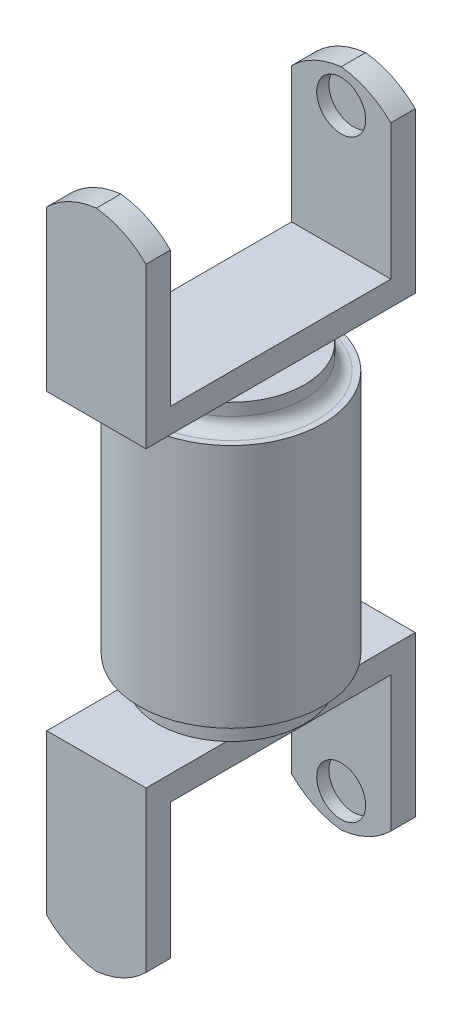
ISO-10303-21;
HEADER;
FILE_DESCRIPTION(('STEP AP214'),'2;1');
FILE_NAME('part.step','',(''),(''),'','','');
FILE_SCHEMA(('AUTOMOTIVE_DESIGN { 1 0 10303 214 1 1 1 1 }'));
ENDSEC;
DATA;
#1=APPLICATION_CONTEXT('core data for automotive mechanical design processes');
#2=APPLICATION_PROTOCOL_DEFINITION('international standard','automotive_design',2000,#1);
#3=PRODUCT_CONTEXT('',#1,'mechanical');
#4=PRODUCT('Part','Part','',(#3));
#5=PRODUCT_RELATED_PRODUCT_CATEGORY('part','',(#4));
#6=PRODUCT_DEFINITION_FORMATION('','',#4);
#7=PRODUCT_DEFINITION_CONTEXT('part definition',#1,'design');
#8=PRODUCT_DEFINITION('design','',#6,#7);
#9=PRODUCT_DEFINITION_SHAPE('','',#8);
#10=(LENGTH_UNIT() NAMED_UNIT(*) SI_UNIT(.MILLI.,.METRE.));
#11=(NAMED_UNIT(*) PLANE_ANGLE_UNIT() SI_UNIT($,.RADIAN.));
#12=(NAMED_UNIT(*) SI_UNIT($,.STERADIAN.) SOLID_ANGLE_UNIT());
#13=UNCERTAINTY_MEASURE_WITH_UNIT(LENGTH_MEASURE(1.E-05),#10,'distance_accuracy_value','');
#14=(GEOMETRIC_REPRESENTATION_CONTEXT(3) GLOBAL_UNCERTAINTY_ASSIGNED_CONTEXT((#13)) GLOBAL_UNIT_ASSIGNED_CONTEXT((#10,
#11,#12)) REPRESENTATION_CONTEXT('',''));
#15=CARTESIAN_POINT('',(0.,0.,0.));
#16=DIRECTION('',(0.,0.,1.));
#17=DIRECTION('',(1.,0.,0.));
#18=AXIS2_PLACEMENT_3D('',#15,#16,#17);
#19=CARTESIAN_POINT('',(-6.,-12.,-11.));
#20=DIRECTION('',(0.,0.,1.));
#21=DIRECTION('',(1.,0.,0.));
#22=AXIS2_PLACEMENT_3D('',#19,#20,#21);
#23=PLANE('',#22);
#24=DIRECTION('',(1.,0.,0.));
#25=VECTOR('',#24,1.);
#26=CARTESIAN_POINT('',(-6.,-12.,-11.));
#27=LINE('',#26,#25);
#28=CARTESIAN_POINT('',(-4.05234317807465,-12.,-11.));
#29=VERTEX_POINT('',#28);
#30=CARTESIAN_POINT('',(4.05234317807465,-12.,-11.));
#31=VERTEX_POINT('',#30);
#32=EDGE_CURVE('E253',#29,#31,#27,.T.);
#33=ORIENTED_EDGE('',*,*,#32,.T.);
#34=DIRECTION('',(0.,1.,0.));
#35=VECTOR('',#34,1.);
#36=CARTESIAN_POINT('',(4.05234317807465,0.,-11.));
#37=LINE('',#36,#35);
#38=CARTESIAN_POINT('',(4.05234317807465,-25.0523431780746,-11.));
#39=VERTEX_POINT('',#38);
#40=EDGE_CURVE('E233',#39,#31,#37,.T.);
#41=ORIENTED_EDGE('',*,*,#40,.F.);
#42=CARTESIAN_POINT('',(-0.750000000000014,-20.25,-11.));
#43=DIRECTION('',(0.,0.,1.));
#44=DIRECTION('',(1.,0.,0.));
#45=AXIS2_PLACEMENT_3D('',#42,#43,#44);
#46=CIRCLE('',#45,6.79153885360307);
#47=CARTESIAN_POINT('',(0.,-27.,-11.));
#48=VERTEX_POINT('',#47);
#49=EDGE_CURVE('E417',#48,#39,#46,.T.);
#50=ORIENTED_EDGE('',*,*,#49,.F.);
#51=CARTESIAN_POINT('',(0.750000000000014,-20.25,-11.));
#52=DIRECTION('',(0.,0.,1.));
#53=DIRECTION('',(1.,0.,0.));
#54=AXIS2_PLACEMENT_3D('',#51,#52,#53);
#55=CIRCLE('',#54,6.79153885360307);
#56=CARTESIAN_POINT('',(-4.05234317807465,-25.0523431780746,-11.));
#57=VERTEX_POINT('',#56);
#58=EDGE_CURVE('E275',#48,#57,#55,.F.);
#59=ORIENTED_EDGE('',*,*,#58,.T.);
#60=DIRECTION('',(0.,1.,0.));
#61=VECTOR('',#60,1.);
#62=CARTESIAN_POINT('',(-4.05234317807465,0.,-11.));
#63=LINE('',#62,#61);
#64=EDGE_CURVE('E89',#57,#29,#63,.T.);
#65=ORIENTED_EDGE('',*,*,#64,.T.);
#66=EDGE_LOOP('',(#33,#41,#50,#59,#65));
#67=FACE_BOUND('',#66,.T.);
#68=ADVANCED_FACE('F74',(#67),#23,.F.);
#69=CARTESIAN_POINT('',(-6.,-27.,-9.));
#70=DIRECTION('',(0.,0.,-1.));
#71=DIRECTION('',(-1.,0.,0.));
#72=AXIS2_PLACEMENT_3D('',#69,#70,#71);
#73=PLANE('',#72);
#74=CARTESIAN_POINT('',(0.,-24.25,-9.));
#75=DIRECTION('',(0.,0.,-1.));
#76=DIRECTION('',(-1.,0.,0.));
#77=AXIS2_PLACEMENT_3D('',#74,#75,#76);
#78=CIRCLE('',#77,2.);
#79=CARTESIAN_POINT('',(-2.,-24.25,-9.));
#80=VERTEX_POINT('',#79);
#81=EDGE_CURVE('E382',#80,#80,#78,.T.);
#82=ORIENTED_EDGE('',*,*,#81,.T.);
#83=EDGE_LOOP('',(#82));
#84=FACE_BOUND('',#83,.T.);
#85=CARTESIAN_POINT('',(-0.750000000000014,-20.25,-9.));
#86=DIRECTION('',(0.,0.,-1.));
#87=DIRECTION('',(-1.,0.,0.));
#88=AXIS2_PLACEMENT_3D('',#85,#86,#87);
#89=CIRCLE('',#88,6.79153885360307);
#90=CARTESIAN_POINT('',(4.05234317807465,-25.0523431780746,-9.));
#91=VERTEX_POINT('',#90);
#92=CARTESIAN_POINT('',(0.,-27.,-9.));
#93=VERTEX_POINT('',#92);
#94=EDGE_CURVE('E411',#91,#93,#89,.T.);
#95=ORIENTED_EDGE('',*,*,#94,.F.);
#96=DIRECTION('',(0.,1.,0.));
#97=VECTOR('',#96,1.);
#98=CARTESIAN_POINT('',(4.05234317807465,-27.,-9.));
#99=LINE('',#98,#97);
#100=CARTESIAN_POINT('',(4.05234317807465,-14.,-9.));
#101=VERTEX_POINT('',#100);
#102=EDGE_CURVE('E404',#91,#101,#99,.T.);
#103=ORIENTED_EDGE('',*,*,#102,.T.);
#104=DIRECTION('',(1.,0.,0.));
#105=VECTOR('',#104,1.);
#106=CARTESIAN_POINT('',(-6.,-14.,-9.));
#107=LINE('',#106,#105);
#108=CARTESIAN_POINT('',(-4.05234317807465,-14.,-9.));
#109=VERTEX_POINT('',#108);
#110=EDGE_CURVE('E264',#109,#101,#107,.T.);
#111=ORIENTED_EDGE('',*,*,#110,.F.);
#112=DIRECTION('',(0.,1.,0.));
#113=VECTOR('',#112,1.);
#114=CARTESIAN_POINT('',(-4.05234317807465,-27.,-9.));
#115=LINE('',#114,#113);
#116=CARTESIAN_POINT('',(-4.05234317807465,-25.0523431780746,-9.));
#117=VERTEX_POINT('',#116);
#118=EDGE_CURVE('E445',#117,#109,#115,.T.);
#119=ORIENTED_EDGE('',*,*,#118,.F.);
#120=CARTESIAN_POINT('',(0.750000000000014,-20.25,-9.));
#121=DIRECTION('',(0.,0.,-1.));
#122=DIRECTION('',(-1.,0.,0.));
#123=AXIS2_PLACEMENT_3D('',#120,#121,#122);
#124=CIRCLE('',#123,6.79153885360307);
#125=EDGE_CURVE('E433',#117,#93,#124,.F.);
#126=ORIENTED_EDGE('',*,*,#125,.T.);
#127=EDGE_LOOP('',(#95,#103,#111,#119,#126));
#128=FACE_BOUND('',#127,.T.);
#129=ADVANCED_FACE('F448',(#84,#128),#73,.F.);
#130=CARTESIAN_POINT('',(-6.,-14.,9.));
#131=DIRECTION('',(0.,0.,1.));
#132=DIRECTION('',(0.,-1.,0.));
#133=AXIS2_PLACEMENT_3D('',#130,#131,#132);
#134=PLANE('',#133);
#135=CARTESIAN_POINT('',(0.,-24.25,9.));
#136=DIRECTION('',(0.,0.,1.));
#137=DIRECTION('',(0.,-1.,0.));
#138=AXIS2_PLACEMENT_3D('',#135,#136,#137);
#139=CIRCLE('',#138,2.);
#140=CARTESIAN_POINT('',(0.,-26.25,9.));
#141=VERTEX_POINT('',#140);
#142=EDGE_CURVE('E378',#141,#141,#139,.T.);
#143=ORIENTED_EDGE('',*,*,#142,.T.);
#144=EDGE_LOOP('',(#143));
#145=FACE_BOUND('',#144,.T.);
#146=DIRECTION('',(1.,0.,0.));
#147=VECTOR('',#146,1.);
#148=CARTESIAN_POINT('',(-6.,-14.,9.));
#149=LINE('',#148,#147);
#150=CARTESIAN_POINT('',(-4.05234317807465,-14.,9.));
#151=VERTEX_POINT('',#150);
#152=CARTESIAN_POINT('',(4.05234317807465,-14.,9.));
#153=VERTEX_POINT('',#152);
#154=EDGE_CURVE('E272',#151,#153,#149,.T.);
#155=ORIENTED_EDGE('',*,*,#154,.T.);
#156=DIRECTION('',(0.,-1.,0.));
#157=VECTOR('',#156,1.);
#158=CARTESIAN_POINT('',(4.05234317807465,-14.,9.));
#159=LINE('',#158,#157);
#160=CARTESIAN_POINT('',(4.05234317807465,-25.0523431780746,9.00000000000001));
#161=VERTEX_POINT('',#160);
#162=EDGE_CURVE('E390',#153,#161,#159,.T.);
#163=ORIENTED_EDGE('',*,*,#162,.T.);
#164=CARTESIAN_POINT('',(-0.750000000000014,-20.25,9.));
#165=DIRECTION('',(0.,0.,1.));
#166=DIRECTION('',(0.,-1.,0.));
#167=AXIS2_PLACEMENT_3D('',#164,#165,#166);
#168=CIRCLE('',#167,6.79153885360307);
#169=CARTESIAN_POINT('',(0.,-27.,9.));
#170=VERTEX_POINT('',#169);
#171=EDGE_CURVE('E399',#170,#161,#168,.T.);
#172=ORIENTED_EDGE('',*,*,#171,.F.);
#173=CARTESIAN_POINT('',(0.750000000000014,-20.25,9.));
#174=DIRECTION('',(0.,0.,1.));
#175=DIRECTION('',(0.,-1.,0.));
#176=AXIS2_PLACEMENT_3D('',#173,#174,#175);
#177=CIRCLE('',#176,6.79153885360307);
#178=CARTESIAN_POINT('',(-4.05234317807465,-25.0523431780746,9.00000000000001));
#179=VERTEX_POINT('',#178);
#180=EDGE_CURVE('E431',#170,#179,#177,.F.);
#181=ORIENTED_EDGE('',*,*,#180,.T.);
#182=DIRECTION('',(0.,-1.,0.));
#183=VECTOR('',#182,1.);
#184=CARTESIAN_POINT('',(-4.05234317807465,-14.,9.));
#185=LINE('',#184,#183);
#186=EDGE_CURVE('E452',#151,#179,#185,.T.);
#187=ORIENTED_EDGE('',*,*,#186,.F.);
#188=EDGE_LOOP('',(#155,#163,#172,#181,#187));
#189=FACE_BOUND('',#188,.T.);
#190=ADVANCED_FACE('F397',(#145,#189),#134,.F.);
#191=CARTESIAN_POINT('',(-6.,-27.,11.));
#192=DIRECTION('',(0.,0.,-1.));
#193=DIRECTION('',(0.,1.,0.));
#194=AXIS2_PLACEMENT_3D('',#191,#192,#193);
#195=PLANE('',#194);
#196=CARTESIAN_POINT('',(-0.750000000000014,-20.25,11.));
#197=DIRECTION('',(0.,0.,-1.));
#198=DIRECTION('',(1.,0.,0.));
#199=AXIS2_PLACEMENT_3D('',#196,#197,#198);
#200=CIRCLE('',#199,6.79153885360307);
#201=CARTESIAN_POINT('',(0.,-27.,11.));
#202=VERTEX_POINT('',#201);
#203=CARTESIAN_POINT('',(4.05234317807465,-25.0523431780746,11.));
#204=VERTEX_POINT('',#203);
#205=EDGE_CURVE('E412',#202,#204,#200,.F.);
#206=ORIENTED_EDGE('',*,*,#205,.T.);
#207=DIRECTION('',(0.,1.,0.));
#208=VECTOR('',#207,1.);
#209=CARTESIAN_POINT('',(4.05234317807465,-27.,11.));
#210=LINE('',#209,#208);
#211=CARTESIAN_POINT('',(4.05234317807465,-12.,11.));
#212=VERTEX_POINT('',#211);
#213=EDGE_CURVE('E97',#204,#212,#210,.T.);
#214=ORIENTED_EDGE('',*,*,#213,.T.);
#215=DIRECTION('',(1.,0.,0.));
#216=VECTOR('',#215,1.);
#217=CARTESIAN_POINT('',(-6.,-12.,11.));
#218=LINE('',#217,#216);
#219=CARTESIAN_POINT('',(-4.05234317807465,-12.,11.));
#220=VERTEX_POINT('',#219);
#221=EDGE_CURVE('E281',#220,#212,#218,.T.);
#222=ORIENTED_EDGE('',*,*,#221,.F.);
#223=DIRECTION('',(0.,1.,0.));
#224=VECTOR('',#223,1.);
#225=CARTESIAN_POINT('',(-4.05234317807465,-27.,11.));
#226=LINE('',#225,#224);
#227=CARTESIAN_POINT('',(-4.05234317807465,-25.0523431780746,11.));
#228=VERTEX_POINT('',#227);
#229=EDGE_CURVE('E451',#228,#220,#226,.T.);
#230=ORIENTED_EDGE('',*,*,#229,.F.);
#231=CARTESIAN_POINT('',(0.750000000000014,-20.25,11.));
#232=DIRECTION('',(0.,0.,-1.));
#233=DIRECTION('',(1.,0.,0.));
#234=AXIS2_PLACEMENT_3D('',#231,#232,#233);
#235=CIRCLE('',#234,6.79153885360307);
#236=EDGE_CURVE('E424',#202,#228,#235,.T.);
#237=ORIENTED_EDGE('',*,*,#236,.F.);
#238=EDGE_LOOP('',(#206,#214,#222,#230,#237));
#239=FACE_BOUND('',#238,.T.);
#240=ADVANCED_FACE('F559',(#239),#195,.F.);
#241=CARTESIAN_POINT('',(-6.,-12.,11.));
#242=DIRECTION('',(0.,-1.,0.));
#243=DIRECTION('',(0.,0.,-1.));
#244=AXIS2_PLACEMENT_3D('',#241,#242,#243);
#245=PLANE('',#244);
#246=CARTESIAN_POINT('',(0.,-12.,0.));
#247=DIRECTION('',(0.,1.,0.));
#248=DIRECTION('',(0.,0.,1.));
#249=AXIS2_PLACEMENT_3D('',#246,#247,#248);
#250=CIRCLE('',#249,6.);
#251=CARTESIAN_POINT('',(4.05234317807465,-12.,-4.42476154918114));
#252=VERTEX_POINT('',#251);
#253=CARTESIAN_POINT('',(-4.05234317807465,-12.,-4.42476154918114));
#254=VERTEX_POINT('',#253);
#255=EDGE_CURVE('E255',#252,#254,#250,.T.);
#256=ORIENTED_EDGE('',*,*,#255,.F.);
#257=DIRECTION('',(0.,0.,-1.));
#258=VECTOR('',#257,1.);
#259=CARTESIAN_POINT('',(4.05234317807465,-12.,13.));
#260=LINE('',#259,#258);
#261=EDGE_CURVE('E237',#252,#31,#260,.T.);
#262=ORIENTED_EDGE('',*,*,#261,.T.);
#263=ORIENTED_EDGE('',*,*,#32,.F.);
#264=DIRECTION('',(0.,0.,-1.));
#265=VECTOR('',#264,1.);
#266=CARTESIAN_POINT('',(-4.05234317807465,-12.,13.));
#267=LINE('',#266,#265);
#268=EDGE_CURVE('E700',#254,#29,#267,.T.);
#269=ORIENTED_EDGE('',*,*,#268,.F.);
#270=EDGE_LOOP('',(#256,#262,#263,#269));
#271=FACE_BOUND('',#270,.T.);
#272=ADVANCED_FACE('F251',(#271),#245,.F.);
#273=CARTESIAN_POINT('',(-6.,-14.,-9.));
#274=DIRECTION('',(0.,1.,0.));
#275=DIRECTION('',(0.,0.,1.));
#276=AXIS2_PLACEMENT_3D('',#273,#274,#275);
#277=PLANE('',#276);
#278=ORIENTED_EDGE('',*,*,#110,.T.);
#279=DIRECTION('',(0.,0.,1.));
#280=VECTOR('',#279,1.);
#281=CARTESIAN_POINT('',(4.05234317807465,-14.,-9.));
#282=LINE('',#281,#280);
#283=EDGE_CURVE('E405',#101,#153,#282,.T.);
#284=ORIENTED_EDGE('',*,*,#283,.T.);
#285=ORIENTED_EDGE('',*,*,#154,.F.);
#286=DIRECTION('',(0.,0.,1.));
#287=VECTOR('',#286,1.);
#288=CARTESIAN_POINT('',(-4.05234317807465,-14.,-9.));
#289=LINE('',#288,#287);
#290=EDGE_CURVE('E458',#109,#151,#289,.T.);
#291=ORIENTED_EDGE('',*,*,#290,.F.);
#292=EDGE_LOOP('',(#278,#284,#285,#291));
#293=FACE_BOUND('',#292,.T.);
#294=ADVANCED_FACE('F552',(#293),#277,.F.);
#295=ORIENTED_EDGE('',*,*,#221,.T.);
#296=CARTESIAN_POINT('',(4.05234317807465,-12.,4.42476154918114));
#297=VERTEX_POINT('',#296);
#298=EDGE_CURVE('E260',#212,#297,#260,.T.);
#299=ORIENTED_EDGE('',*,*,#298,.T.);
#300=CARTESIAN_POINT('',(-4.05234317807465,-12.,4.42476154918114));
#301=VERTEX_POINT('',#300);
#302=EDGE_CURVE('E269',#301,#297,#250,.T.);
#303=ORIENTED_EDGE('',*,*,#302,.F.);
#304=EDGE_CURVE('E691',#220,#301,#267,.T.);
#305=ORIENTED_EDGE('',*,*,#304,.F.);
#306=EDGE_LOOP('',(#295,#299,#303,#305));
#307=FACE_BOUND('',#306,.T.);
#308=ADVANCED_FACE('F555',(#307),#245,.F.);
#309=CARTESIAN_POINT('',(0.750000000000014,-20.25,-18.));
#310=DIRECTION('',(0.,0.,1.));
#311=DIRECTION('',(1.,0.,0.));
#312=AXIS2_PLACEMENT_3D('',#309,#310,#311);
#313=CYLINDRICAL_SURFACE('',#312,6.79153885360307);
#314=DIRECTION('',(0.,0.,-1.));
#315=VECTOR('',#314,1.);
#316=CARTESIAN_POINT('',(-4.05234317807465,-25.0523431780746,13.));
#317=LINE('',#316,#315);
#318=EDGE_CURVE('E246',#228,#179,#317,.T.);
#319=ORIENTED_EDGE('',*,*,#318,.T.);
#320=ORIENTED_EDGE('',*,*,#180,.F.);
#321=DIRECTION('',(0.,0.,1.));
#322=VECTOR('',#321,1.);
#323=CARTESIAN_POINT('',(0.,-27.,-18.));
#324=LINE('',#323,#322);
#325=EDGE_CURVE('E409',#170,#202,#324,.T.);
#326=ORIENTED_EDGE('',*,*,#325,.T.);
#327=ORIENTED_EDGE('',*,*,#236,.T.);
#328=EDGE_LOOP('',(#319,#320,#326,#327));
#329=FACE_BOUND('',#328,.T.);
#330=ADVANCED_FACE('F550',(#329),#313,.T.);
#331=DIRECTION('',(0.,0.,1.));
#332=VECTOR('',#331,1.);
#333=CARTESIAN_POINT('',(-4.05234317807465,-25.0523431780746,-18.));
#334=LINE('',#333,#332);
#335=EDGE_CURVE('E12',#57,#117,#334,.T.);
#336=ORIENTED_EDGE('',*,*,#335,.F.);
#337=ORIENTED_EDGE('',*,*,#58,.F.);
#338=EDGE_CURVE('E430',#48,#93,#324,.T.);
#339=ORIENTED_EDGE('',*,*,#338,.T.);
#340=ORIENTED_EDGE('',*,*,#125,.F.);
#341=EDGE_LOOP('',(#336,#337,#339,#340));
#342=FACE_BOUND('',#341,.T.);
#343=ADVANCED_FACE('F443',(#342),#313,.T.);
#344=CARTESIAN_POINT('',(-6.,27.,11.));
#345=DIRECTION('',(0.,0.,1.));
#346=DIRECTION('',(0.,-1.,0.));
#347=AXIS2_PLACEMENT_3D('',#344,#345,#346);
#348=PLANE('',#347);
#349=DIRECTION('',(1.,0.,0.));
#350=VECTOR('',#349,1.);
#351=CARTESIAN_POINT('',(-6.,12.,11.));
#352=LINE('',#351,#350);
#353=CARTESIAN_POINT('',(-4.05234317807465,12.,11.));
#354=VERTEX_POINT('',#353);
#355=CARTESIAN_POINT('',(4.05234317807465,12.,11.));
#356=VERTEX_POINT('',#355);
#357=EDGE_CURVE('E341',#354,#356,#352,.T.);
#358=ORIENTED_EDGE('',*,*,#357,.T.);
#359=DIRECTION('',(0.,1.,0.));
#360=VECTOR('',#359,1.);
#361=CARTESIAN_POINT('',(4.05234317807465,27.,11.));
#362=LINE('',#361,#360);
#363=CARTESIAN_POINT('',(4.05234317807465,25.0523431780746,11.));
#364=VERTEX_POINT('',#363);
#365=EDGE_CURVE('E498',#356,#364,#362,.T.);
#366=ORIENTED_EDGE('',*,*,#365,.T.);
#367=CARTESIAN_POINT('',(-0.750000000000014,20.25,11.));
#368=DIRECTION('',(0.,0.,1.));
#369=DIRECTION('',(1.,0.,0.));
#370=AXIS2_PLACEMENT_3D('',#367,#368,#369);
#371=CIRCLE('',#370,6.79153885360307);
#372=CARTESIAN_POINT('',(0.,27.,11.));
#373=VERTEX_POINT('',#372);
#374=EDGE_CURVE('E306',#373,#364,#371,.F.);
#375=ORIENTED_EDGE('',*,*,#374,.F.);
#376=CARTESIAN_POINT('',(0.750000000000014,20.25,11.));
#377=DIRECTION('',(0.,0.,1.));
#378=DIRECTION('',(1.,0.,0.));
#379=AXIS2_PLACEMENT_3D('',#376,#377,#378);
#380=CIRCLE('',#379,6.79153885360307);
#381=CARTESIAN_POINT('',(-4.05234317807465,25.0523431780746,11.));
#382=VERTEX_POINT('',#381);
#383=EDGE_CURVE('E322',#373,#382,#380,.T.);
#384=ORIENTED_EDGE('',*,*,#383,.T.);
#385=DIRECTION('',(0.,1.,0.));
#386=VECTOR('',#385,1.);
#387=CARTESIAN_POINT('',(-4.05234317807465,27.,11.));
#388=LINE('',#387,#386);
#389=EDGE_CURVE('E511',#354,#382,#388,.T.);
#390=ORIENTED_EDGE('',*,*,#389,.F.);
#391=EDGE_LOOP('',(#358,#366,#375,#384,#390));
#392=FACE_BOUND('',#391,.T.);
#393=ADVANCED_FACE('F605',(#392),#348,.T.);
#394=CARTESIAN_POINT('',(-6.,14.,9.));
#395=DIRECTION('',(0.,0.,-1.));
#396=DIRECTION('',(0.,1.,0.));
#397=AXIS2_PLACEMENT_3D('',#394,#395,#396);
#398=PLANE('',#397);
#399=CARTESIAN_POINT('',(0.,24.25,9.));
#400=DIRECTION('',(0.,0.,-1.));
#401=DIRECTION('',(0.,1.,0.));
#402=AXIS2_PLACEMENT_3D('',#399,#400,#401);
#403=CIRCLE('',#402,2.);
#404=CARTESIAN_POINT('',(0.,26.25,9.));
#405=VERTEX_POINT('',#404);
#406=EDGE_CURVE('E302',#405,#405,#403,.F.);
#407=ORIENTED_EDGE('',*,*,#406,.T.);
#408=EDGE_LOOP('',(#407));
#409=FACE_BOUND('',#408,.T.);
#410=CARTESIAN_POINT('',(-0.750000000000014,20.25,9.));
#411=DIRECTION('',(0.,0.,-1.));
#412=DIRECTION('',(0.,1.,0.));
#413=AXIS2_PLACEMENT_3D('',#410,#411,#412);
#414=CIRCLE('',#413,6.79153885360307);
#415=CARTESIAN_POINT('',(4.05234317807465,25.0523431780746,9.));
#416=VERTEX_POINT('',#415);
#417=CARTESIAN_POINT('',(0.,27.,9.00000000000001));
#418=VERTEX_POINT('',#417);
#419=EDGE_CURVE('E318',#416,#418,#414,.F.);
#420=ORIENTED_EDGE('',*,*,#419,.F.);
#421=DIRECTION('',(0.,-1.,0.));
#422=VECTOR('',#421,1.);
#423=CARTESIAN_POINT('',(4.05234317807465,14.,9.));
#424=LINE('',#423,#422);
#425=CARTESIAN_POINT('',(4.05234317807465,14.,9.));
#426=VERTEX_POINT('',#425);
#427=EDGE_CURVE('E494',#416,#426,#424,.T.);
#428=ORIENTED_EDGE('',*,*,#427,.T.);
#429=DIRECTION('',(1.,0.,0.));
#430=VECTOR('',#429,1.);
#431=CARTESIAN_POINT('',(-6.,14.,9.));
#432=LINE('',#431,#430);
#433=CARTESIAN_POINT('',(-4.05234317807465,14.,9.));
#434=VERTEX_POINT('',#433);
#435=EDGE_CURVE('E346',#434,#426,#432,.T.);
#436=ORIENTED_EDGE('',*,*,#435,.F.);
#437=DIRECTION('',(0.,-1.,0.));
#438=VECTOR('',#437,1.);
#439=CARTESIAN_POINT('',(-4.05234317807465,14.,9.));
#440=LINE('',#439,#438);
#441=CARTESIAN_POINT('',(-4.05234317807465,25.0523431780746,9.00000000000001));
#442=VERTEX_POINT('',#441);
#443=EDGE_CURVE('E508',#442,#434,#440,.T.);
#444=ORIENTED_EDGE('',*,*,#443,.F.);
#445=CARTESIAN_POINT('',(0.750000000000014,20.25,9.));
#446=DIRECTION('',(0.,0.,-1.));
#447=DIRECTION('',(0.,1.,0.));
#448=AXIS2_PLACEMENT_3D('',#445,#446,#447);
#449=CIRCLE('',#448,6.79153885360307);
#450=EDGE_CURVE('E337',#442,#418,#449,.T.);
#451=ORIENTED_EDGE('',*,*,#450,.T.);
#452=EDGE_LOOP('',(#420,#428,#436,#444,#451));
#453=FACE_BOUND('',#452,.T.);
#454=ADVANCED_FACE('F608',(#409,#453),#398,.T.);
#455=CARTESIAN_POINT('',(-6.,27.,-9.));
#456=DIRECTION('',(0.,0.,1.));
#457=DIRECTION('',(1.,0.,0.));
#458=AXIS2_PLACEMENT_3D('',#455,#456,#457);
#459=PLANE('',#458);
#460=CARTESIAN_POINT('',(0.,24.25,-9.));
#461=DIRECTION('',(0.,0.,1.));
#462=DIRECTION('',(1.,0.,0.));
#463=AXIS2_PLACEMENT_3D('',#460,#461,#462);
#464=CIRCLE('',#463,2.);
#465=CARTESIAN_POINT('',(2.,24.25,-9.));
#466=VERTEX_POINT('',#465);
#467=EDGE_CURVE('E301',#466,#466,#464,.F.);
#468=ORIENTED_EDGE('',*,*,#467,.T.);
#469=EDGE_LOOP('',(#468));
#470=FACE_BOUND('',#469,.T.);
#471=DIRECTION('',(1.,0.,0.));
#472=VECTOR('',#471,1.);
#473=CARTESIAN_POINT('',(-6.,14.,-9.));
#474=LINE('',#473,#472);
#475=CARTESIAN_POINT('',(-4.05234317807465,14.,-9.));
#476=VERTEX_POINT('',#475);
#477=CARTESIAN_POINT('',(4.05234317807465,14.,-9.));
#478=VERTEX_POINT('',#477);
#479=EDGE_CURVE('E350',#476,#478,#474,.T.);
#480=ORIENTED_EDGE('',*,*,#479,.T.);
#481=DIRECTION('',(0.,1.,0.));
#482=VECTOR('',#481,1.);
#483=CARTESIAN_POINT('',(4.05234317807465,27.,-9.));
#484=LINE('',#483,#482);
#485=CARTESIAN_POINT('',(4.05234317807465,25.0523431780746,-9.));
#486=VERTEX_POINT('',#485);
#487=EDGE_CURVE('E490',#478,#486,#484,.T.);
#488=ORIENTED_EDGE('',*,*,#487,.T.);
#489=CARTESIAN_POINT('',(-0.750000000000014,20.25,-9.));
#490=DIRECTION('',(0.,0.,1.));
#491=DIRECTION('',(1.,0.,0.));
#492=AXIS2_PLACEMENT_3D('',#489,#490,#491);
#493=CIRCLE('',#492,6.79153885360307);
#494=CARTESIAN_POINT('',(0.,27.,-9.));
#495=VERTEX_POINT('',#494);
#496=EDGE_CURVE('E314',#495,#486,#493,.F.);
#497=ORIENTED_EDGE('',*,*,#496,.F.);
#498=CARTESIAN_POINT('',(0.750000000000014,20.25,-9.));
#499=DIRECTION('',(0.,0.,1.));
#500=DIRECTION('',(1.,0.,0.));
#501=AXIS2_PLACEMENT_3D('',#498,#499,#500);
#502=CIRCLE('',#501,6.79153885360307);
#503=CARTESIAN_POINT('',(-4.05234317807465,25.0523431780746,-9.));
#504=VERTEX_POINT('',#503);
#505=EDGE_CURVE('E333',#495,#504,#502,.T.);
#506=ORIENTED_EDGE('',*,*,#505,.T.);
#507=DIRECTION('',(0.,1.,0.));
#508=VECTOR('',#507,1.);
#509=CARTESIAN_POINT('',(-4.05234317807465,27.,-9.));
#510=LINE('',#509,#508);
#511=EDGE_CURVE('E505',#476,#504,#510,.T.);
#512=ORIENTED_EDGE('',*,*,#511,.F.);
#513=EDGE_LOOP('',(#480,#488,#497,#506,#512));
#514=FACE_BOUND('',#513,.T.);
#515=ADVANCED_FACE('F612',(#470,#514),#459,.T.);
#516=CARTESIAN_POINT('',(-6.,12.,-11.));
#517=DIRECTION('',(0.,0.,-1.));
#518=DIRECTION('',(-1.,0.,0.));
#519=AXIS2_PLACEMENT_3D('',#516,#517,#518);
#520=PLANE('',#519);
#521=CARTESIAN_POINT('',(-0.750000000000014,20.25,-11.));
#522=DIRECTION('',(0.,0.,-1.));
#523=DIRECTION('',(-1.,0.,0.));
#524=AXIS2_PLACEMENT_3D('',#521,#522,#523);
#525=CIRCLE('',#524,6.79153885360307);
#526=CARTESIAN_POINT('',(4.05234317807465,25.0523431780746,-11.));
#527=VERTEX_POINT('',#526);
#528=CARTESIAN_POINT('',(0.,27.,-11.));
#529=VERTEX_POINT('',#528);
#530=EDGE_CURVE('E310',#527,#529,#525,.F.);
#531=ORIENTED_EDGE('',*,*,#530,.F.);
#532=DIRECTION('',(0.,-1.,0.));
#533=VECTOR('',#532,1.);
#534=CARTESIAN_POINT('',(4.05234317807465,0.,-11.));
#535=LINE('',#534,#533);
#536=CARTESIAN_POINT('',(4.05234317807465,12.,-11.));
#537=VERTEX_POINT('',#536);
#538=EDGE_CURVE('E462',#527,#537,#535,.T.);
#539=ORIENTED_EDGE('',*,*,#538,.T.);
#540=DIRECTION('',(1.,0.,0.));
#541=VECTOR('',#540,1.);
#542=CARTESIAN_POINT('',(-6.,12.,-11.));
#543=LINE('',#542,#541);
#544=CARTESIAN_POINT('',(-4.05234317807465,12.,-11.));
#545=VERTEX_POINT('',#544);
#546=EDGE_CURVE('E340',#545,#537,#543,.T.);
#547=ORIENTED_EDGE('',*,*,#546,.F.);
#548=DIRECTION('',(0.,-1.,0.));
#549=VECTOR('',#548,1.);
#550=CARTESIAN_POINT('',(-4.05234317807465,0.,-11.));
#551=LINE('',#550,#549);
#552=CARTESIAN_POINT('',(-4.05234317807465,25.0523431780746,-11.));
#553=VERTEX_POINT('',#552);
#554=EDGE_CURVE('E456',#553,#545,#551,.T.);
#555=ORIENTED_EDGE('',*,*,#554,.F.);
#556=CARTESIAN_POINT('',(0.750000000000014,20.25,-11.));
#557=DIRECTION('',(0.,0.,-1.));
#558=DIRECTION('',(-1.,0.,0.));
#559=AXIS2_PLACEMENT_3D('',#556,#557,#558);
#560=CIRCLE('',#559,6.79153885360307);
#561=EDGE_CURVE('E330',#553,#529,#560,.T.);
#562=ORIENTED_EDGE('',*,*,#561,.T.);
#563=EDGE_LOOP('',(#531,#539,#547,#555,#562));
#564=FACE_BOUND('',#563,.T.);
#565=ADVANCED_FACE('F603',(#564),#520,.T.);
#566=CARTESIAN_POINT('',(-6.,12.,-6.));
#567=DIRECTION('',(0.,-1.,0.));
#568=DIRECTION('',(0.,0.,-1.));
#569=AXIS2_PLACEMENT_3D('',#566,#567,#568);
#570=PLANE('',#569);
#571=ORIENTED_EDGE('',*,*,#546,.T.);
#572=DIRECTION('',(0.,0.,-1.));
#573=VECTOR('',#572,1.);
#574=CARTESIAN_POINT('',(4.05234317807465,12.,13.));
#575=LINE('',#574,#573);
#576=CARTESIAN_POINT('',(4.05234317807465,12.,-4.42476154918114));
#577=VERTEX_POINT('',#576);
#578=EDGE_CURVE('E468',#577,#537,#575,.T.);
#579=ORIENTED_EDGE('',*,*,#578,.F.);
#580=CARTESIAN_POINT('',(0.,12.,0.));
#581=DIRECTION('',(0.,1.,0.));
#582=DIRECTION('',(0.,0.,1.));
#583=AXIS2_PLACEMENT_3D('',#580,#581,#582);
#584=CIRCLE('',#583,6.);
#585=CARTESIAN_POINT('',(-4.05234317807465,12.,-4.42476154918114));
#586=VERTEX_POINT('',#585);
#587=EDGE_CURVE('E361',#577,#586,#584,.T.);
#588=ORIENTED_EDGE('',*,*,#587,.T.);
#589=DIRECTION('',(0.,0.,-1.));
#590=VECTOR('',#589,1.);
#591=CARTESIAN_POINT('',(-4.05234317807465,12.,13.));
#592=LINE('',#591,#590);
#593=EDGE_CURVE('E479',#586,#545,#592,.T.);
#594=ORIENTED_EDGE('',*,*,#593,.T.);
#595=EDGE_LOOP('',(#571,#579,#588,#594));
#596=FACE_BOUND('',#595,.T.);
#597=ADVANCED_FACE('F599',(#596),#570,.T.);
#598=CARTESIAN_POINT('',(-4.05234317807465,12.,4.42476154918114));
#599=VERTEX_POINT('',#598);
#600=CARTESIAN_POINT('',(4.05234317807465,12.,4.42476154918114));
#601=VERTEX_POINT('',#600);
#602=EDGE_CURVE('E345',#599,#601,#584,.T.);
#603=ORIENTED_EDGE('',*,*,#602,.T.);
#604=EDGE_CURVE('E472',#356,#601,#575,.T.);
#605=ORIENTED_EDGE('',*,*,#604,.F.);
#606=ORIENTED_EDGE('',*,*,#357,.F.);
#607=EDGE_CURVE('E467',#354,#599,#592,.T.);
#608=ORIENTED_EDGE('',*,*,#607,.T.);
#609=EDGE_LOOP('',(#603,#605,#606,#608));
#610=FACE_BOUND('',#609,.T.);
#611=ADVANCED_FACE('F602',(#610),#570,.T.);
#612=CARTESIAN_POINT('',(-6.,14.,-9.));
#613=DIRECTION('',(0.,1.,0.));
#614=DIRECTION('',(0.,0.,1.));
#615=AXIS2_PLACEMENT_3D('',#612,#613,#614);
#616=PLANE('',#615);
#617=ORIENTED_EDGE('',*,*,#435,.T.);
#618=DIRECTION('',(0.,0.,-1.));
#619=VECTOR('',#618,1.);
#620=CARTESIAN_POINT('',(4.05234317807465,14.,-9.));
#621=LINE('',#620,#619);
#622=EDGE_CURVE('E486',#426,#478,#621,.T.);
#623=ORIENTED_EDGE('',*,*,#622,.T.);
#624=ORIENTED_EDGE('',*,*,#479,.F.);
#625=DIRECTION('',(0.,0.,-1.));
#626=VECTOR('',#625,1.);
#627=CARTESIAN_POINT('',(-4.05234317807465,14.,-9.));
#628=LINE('',#627,#626);
#629=EDGE_CURVE('E502',#434,#476,#628,.T.);
#630=ORIENTED_EDGE('',*,*,#629,.F.);
#631=EDGE_LOOP('',(#617,#623,#624,#630));
#632=FACE_BOUND('',#631,.T.);
#633=ADVANCED_FACE('F593',(#632),#616,.T.);
#634=CARTESIAN_POINT('',(-0.750000000000014,20.25,-18.));
#635=DIRECTION('',(0.,0.,1.));
#636=DIRECTION('',(1.,0.,0.));
#637=AXIS2_PLACEMENT_3D('',#634,#635,#636);
#638=CYLINDRICAL_SURFACE('',#637,6.79153885360307);
#639=DIRECTION('',(0.,0.,-1.));
#640=VECTOR('',#639,1.);
#641=CARTESIAN_POINT('',(4.05234317807465,25.0523431780746,13.));
#642=LINE('',#641,#640);
#643=EDGE_CURVE('E466',#486,#527,#642,.T.);
#644=ORIENTED_EDGE('',*,*,#643,.T.);
#645=ORIENTED_EDGE('',*,*,#530,.T.);
#646=DIRECTION('',(0.,0.,1.));
#647=VECTOR('',#646,1.);
#648=CARTESIAN_POINT('',(0.,27.,-18.));
#649=LINE('',#648,#647);
#650=EDGE_CURVE('E329',#529,#495,#649,.T.);
#651=ORIENTED_EDGE('',*,*,#650,.T.);
#652=ORIENTED_EDGE('',*,*,#496,.T.);
#653=EDGE_LOOP('',(#644,#645,#651,#652));
#654=FACE_BOUND('',#653,.T.);
#655=ADVANCED_FACE('F589',(#654),#638,.T.);
#656=DIRECTION('',(0.,0.,1.));
#657=VECTOR('',#656,1.);
#658=CARTESIAN_POINT('',(4.05234317807465,25.0523431780746,-18.));
#659=LINE('',#658,#657);
#660=EDGE_CURVE('E374',#416,#364,#659,.T.);
#661=ORIENTED_EDGE('',*,*,#660,.F.);
#662=ORIENTED_EDGE('',*,*,#419,.T.);
#663=EDGE_CURVE('E326',#418,#373,#649,.T.);
#664=ORIENTED_EDGE('',*,*,#663,.T.);
#665=ORIENTED_EDGE('',*,*,#374,.T.);
#666=EDGE_LOOP('',(#661,#662,#664,#665));
#667=FACE_BOUND('',#666,.T.);
#668=ADVANCED_FACE('F592',(#667),#638,.T.);
#669=CARTESIAN_POINT('',(0.,10.,0.));
#670=DIRECTION('',(0.,-1.,0.));
#671=DIRECTION('',(0.,0.,-1.));
#672=AXIS2_PLACEMENT_3D('',#669,#670,#671);
#673=CYLINDRICAL_SURFACE('',#672,7.5);
#674=CARTESIAN_POINT('',(0.,10.,0.));
#675=DIRECTION('',(0.,1.,0.));
#676=DIRECTION('',(0.,0.,1.));
#677=AXIS2_PLACEMENT_3D('',#674,#675,#676);
#678=CIRCLE('',#677,7.5);
#679=CARTESIAN_POINT('',(0.,10.,7.5));
#680=VERTEX_POINT('',#679);
#681=EDGE_CURVE('E360',#680,#680,#678,.T.);
#682=ORIENTED_EDGE('',*,*,#681,.F.);
#683=EDGE_LOOP('',(#682));
#684=FACE_BOUND('',#683,.T.);
#685=CARTESIAN_POINT('',(0.,-10.,0.));
#686=DIRECTION('',(0.,1.,0.));
#687=DIRECTION('',(0.,0.,1.));
#688=AXIS2_PLACEMENT_3D('',#685,#686,#687);
#689=CIRCLE('',#688,7.5);
#690=CARTESIAN_POINT('',(0.,-10.,7.5));
#691=VERTEX_POINT('',#690);
#692=EDGE_CURVE('E287',#691,#691,#689,.T.);
#693=ORIENTED_EDGE('',*,*,#692,.T.);
#694=EDGE_LOOP('',(#693));
#695=FACE_BOUND('',#694,.T.);
#696=ADVANCED_FACE('F629',(#684,#695),#673,.T.);
#697=CARTESIAN_POINT('',(0.,10.,0.));
#698=DIRECTION('',(0.,1.,0.));
#699=DIRECTION('',(0.,0.,1.));
#700=AXIS2_PLACEMENT_3D('',#697,#698,#699);
#701=PLANE('',#700);
#702=CARTESIAN_POINT('',(0.,10.,0.));
#703=DIRECTION('',(0.,1.,0.));
#704=DIRECTION('',(0.,0.,1.));
#705=AXIS2_PLACEMENT_3D('',#702,#703,#704);
#706=CIRCLE('',#705,7.);
#707=CARTESIAN_POINT('',(0.,10.,7.));
#708=VERTEX_POINT('',#707);
#709=EDGE_CURVE('E370',#708,#708,#706,.F.);
#710=ORIENTED_EDGE('',*,*,#709,.T.);
#711=EDGE_LOOP('',(#710));
#712=FACE_BOUND('',#711,.T.);
#713=ORIENTED_EDGE('',*,*,#681,.T.);
#714=EDGE_LOOP('',(#713));
#715=FACE_BOUND('',#714,.T.);
#716=ADVANCED_FACE('F626',(#712,#715),#701,.T.);
#717=CARTESIAN_POINT('',(0.,12.,0.));
#718=DIRECTION('',(0.,-1.,0.));
#719=DIRECTION('',(0.,0.,-1.));
#720=AXIS2_PLACEMENT_3D('',#717,#718,#719);
#721=CYLINDRICAL_SURFACE('',#720,6.);
#722=CARTESIAN_POINT('',(0.,11.,0.));
#723=DIRECTION('',(0.,1.,0.));
#724=DIRECTION('',(0.,0.,1.));
#725=AXIS2_PLACEMENT_3D('',#722,#723,#724);
#726=CIRCLE('',#725,6.);
#727=CARTESIAN_POINT('',(0.,11.,6.));
#728=VERTEX_POINT('',#727);
#729=EDGE_CURVE('E366',#728,#728,#726,.T.);
#730=ORIENTED_EDGE('',*,*,#729,.T.);
#731=EDGE_LOOP('',(#730));
#732=FACE_BOUND('',#731,.T.);
#733=EDGE_CURVE('E357',#601,#577,#584,.T.);
#734=ORIENTED_EDGE('',*,*,#733,.F.);
#735=ORIENTED_EDGE('',*,*,#602,.F.);
#736=EDGE_CURVE('E362',#586,#599,#584,.T.);
#737=ORIENTED_EDGE('',*,*,#736,.F.);
#738=ORIENTED_EDGE('',*,*,#587,.F.);
#739=EDGE_LOOP('',(#734,#735,#737,#738));
#740=FACE_BOUND('',#739,.T.);
#741=ADVANCED_FACE('F623',(#732,#740),#721,.T.);
#742=CARTESIAN_POINT('',(0.,11.,0.));
#743=DIRECTION('',(0.,1.,0.));
#744=DIRECTION('',(0.,0.,1.));
#745=AXIS2_PLACEMENT_3D('',#742,#743,#744);
#746=TOROIDAL_SURFACE('',#745,7.,1.);
#747=ORIENTED_EDGE('',*,*,#709,.F.);
#748=EDGE_LOOP('',(#747));
#749=FACE_BOUND('',#748,.T.);
#750=ORIENTED_EDGE('',*,*,#729,.F.);
#751=EDGE_LOOP('',(#750));
#752=FACE_BOUND('',#751,.T.);
#753=ADVANCED_FACE('F76',(#749,#752),#746,.F.);
#754=CARTESIAN_POINT('',(0.750000000000014,20.25,-18.));
#755=DIRECTION('',(0.,0.,1.));
#756=DIRECTION('',(1.,0.,0.));
#757=AXIS2_PLACEMENT_3D('',#754,#755,#756);
#758=CYLINDRICAL_SURFACE('',#757,6.79153885360307);
#759=DIRECTION('',(0.,0.,-1.));
#760=VECTOR('',#759,1.);
#761=CARTESIAN_POINT('',(-4.05234317807465,25.0523431780746,13.));
#762=LINE('',#761,#760);
#763=EDGE_CURVE('E478',#382,#442,#762,.T.);
#764=ORIENTED_EDGE('',*,*,#763,.F.);
#765=ORIENTED_EDGE('',*,*,#383,.F.);
#766=ORIENTED_EDGE('',*,*,#663,.F.);
#767=ORIENTED_EDGE('',*,*,#450,.F.);
#768=EDGE_LOOP('',(#764,#765,#766,#767));
#769=FACE_BOUND('',#768,.T.);
#770=ADVANCED_FACE('F597',(#769),#758,.T.);
#771=DIRECTION('',(0.,0.,1.));
#772=VECTOR('',#771,1.);
#773=CARTESIAN_POINT('',(-4.05234317807465,25.0523431780746,-18.));
#774=LINE('',#773,#772);
#775=EDGE_CURVE('E386',#504,#553,#774,.F.);
#776=ORIENTED_EDGE('',*,*,#775,.F.);
#777=ORIENTED_EDGE('',*,*,#505,.F.);
#778=ORIENTED_EDGE('',*,*,#650,.F.);
#779=ORIENTED_EDGE('',*,*,#561,.F.);
#780=EDGE_LOOP('',(#776,#777,#778,#779));
#781=FACE_BOUND('',#780,.T.);
#782=ADVANCED_FACE('F584',(#781),#758,.T.);
#783=CARTESIAN_POINT('',(0.,24.25,-10.));
#784=DIRECTION('',(0.,0.,-1.));
#785=DIRECTION('',(0.,1.,0.));
#786=AXIS2_PLACEMENT_3D('',#783,#784,#785);
#787=PLANE('',#786);
#788=CARTESIAN_POINT('',(0.,24.25,-10.));
#789=DIRECTION('',(0.,0.,-1.));
#790=DIRECTION('',(0.,1.,0.));
#791=AXIS2_PLACEMENT_3D('',#788,#789,#790);
#792=CIRCLE('',#791,2.);
#793=CARTESIAN_POINT('',(0.,26.25,-10.));
#794=VERTEX_POINT('',#793);
#795=EDGE_CURVE('E297',#794,#794,#792,.T.);
#796=ORIENTED_EDGE('',*,*,#795,.F.);
#797=EDGE_LOOP('',(#796));
#798=FACE_BOUND('',#797,.T.);
#799=ADVANCED_FACE('F580',(#798),#787,.F.);
#800=CARTESIAN_POINT('',(0.,24.25,-10.));
#801=DIRECTION('',(0.,0.,1.));
#802=DIRECTION('',(0.,-1.,0.));
#803=AXIS2_PLACEMENT_3D('',#800,#801,#802);
#804=CYLINDRICAL_SURFACE('',#803,2.);
#805=ORIENTED_EDGE('',*,*,#467,.F.);
#806=EDGE_LOOP('',(#805));
#807=FACE_BOUND('',#806,.T.);
#808=ORIENTED_EDGE('',*,*,#795,.T.);
#809=EDGE_LOOP('',(#808));
#810=FACE_BOUND('',#809,.T.);
#811=ADVANCED_FACE('F583',(#807,#810),#804,.F.);
#812=ORIENTED_EDGE('',*,*,#406,.F.);
#813=EDGE_LOOP('',(#812));
#814=FACE_BOUND('',#813,.T.);
#815=CARTESIAN_POINT('',(0.,24.25,10.));
#816=DIRECTION('',(0.,0.,-1.));
#817=DIRECTION('',(0.,1.,0.));
#818=AXIS2_PLACEMENT_3D('',#815,#816,#817);
#819=CIRCLE('',#818,2.);
#820=CARTESIAN_POINT('',(0.,26.25,10.));
#821=VERTEX_POINT('',#820);
#822=EDGE_CURVE('E293',#821,#821,#819,.T.);
#823=ORIENTED_EDGE('',*,*,#822,.F.);
#824=EDGE_LOOP('',(#823));
#825=FACE_BOUND('',#824,.T.);
#826=ADVANCED_FACE('F578',(#814,#825),#804,.F.);
#827=CARTESIAN_POINT('',(0.,24.25,10.));
#828=DIRECTION('',(0.,0.,-1.));
#829=DIRECTION('',(0.,1.,0.));
#830=AXIS2_PLACEMENT_3D('',#827,#828,#829);
#831=PLANE('',#830);
#832=ORIENTED_EDGE('',*,*,#822,.T.);
#833=EDGE_LOOP('',(#832));
#834=FACE_BOUND('',#833,.T.);
#835=ADVANCED_FACE('F574',(#834),#831,.T.);
#836=CARTESIAN_POINT('',(0.,-10.,0.));
#837=DIRECTION('',(0.,-1.,0.));
#838=DIRECTION('',(0.,0.,1.));
#839=AXIS2_PLACEMENT_3D('',#836,#837,#838);
#840=PLANE('',#839);
#841=CARTESIAN_POINT('',(0.,-10.,0.));
#842=DIRECTION('',(0.,1.,0.));
#843=DIRECTION('',(0.,0.,1.));
#844=AXIS2_PLACEMENT_3D('',#841,#842,#843);
#845=CIRCLE('',#844,6.);
#846=CARTESIAN_POINT('',(0.,-10.,6.));
#847=VERTEX_POINT('',#846);
#848=EDGE_CURVE('E263',#847,#847,#845,.T.);
#849=ORIENTED_EDGE('',*,*,#848,.T.);
#850=EDGE_LOOP('',(#849));
#851=FACE_BOUND('',#850,.T.);
#852=ORIENTED_EDGE('',*,*,#692,.F.);
#853=EDGE_LOOP('',(#852));
#854=FACE_BOUND('',#853,.T.);
#855=ADVANCED_FACE('F570',(#851,#854),#840,.T.);
#856=CARTESIAN_POINT('',(0.,-12.,0.));
#857=DIRECTION('',(0.,1.,0.));
#858=DIRECTION('',(0.,0.,1.));
#859=AXIS2_PLACEMENT_3D('',#856,#857,#858);
#860=CYLINDRICAL_SURFACE('',#859,6.);
#861=EDGE_CURVE('E285',#297,#252,#250,.T.);
#862=ORIENTED_EDGE('',*,*,#861,.T.);
#863=ORIENTED_EDGE('',*,*,#255,.T.);
#864=EDGE_CURVE('E288',#254,#301,#250,.T.);
#865=ORIENTED_EDGE('',*,*,#864,.T.);
#866=ORIENTED_EDGE('',*,*,#302,.T.);
#867=EDGE_LOOP('',(#862,#863,#865,#866));
#868=FACE_BOUND('',#867,.T.);
#869=ORIENTED_EDGE('',*,*,#848,.F.);
#870=EDGE_LOOP('',(#869));
#871=FACE_BOUND('',#870,.T.);
#872=ADVANCED_FACE('F566',(#868,#871),#860,.T.);
#873=CARTESIAN_POINT('',(-0.750000000000014,-20.25,-18.));
#874=DIRECTION('',(0.,0.,1.));
#875=DIRECTION('',(1.,0.,0.));
#876=AXIS2_PLACEMENT_3D('',#873,#874,#875);
#877=CYLINDRICAL_SURFACE('',#876,6.79153885360307);
#878=DIRECTION('',(0.,0.,-1.));
#879=VECTOR('',#878,1.);
#880=CARTESIAN_POINT('',(4.05234317807465,-25.0523431780746,13.));
#881=LINE('',#880,#879);
#882=EDGE_CURVE('E240',#91,#39,#881,.T.);
#883=ORIENTED_EDGE('',*,*,#882,.F.);
#884=ORIENTED_EDGE('',*,*,#94,.T.);
#885=ORIENTED_EDGE('',*,*,#338,.F.);
#886=ORIENTED_EDGE('',*,*,#49,.T.);
#887=EDGE_LOOP('',(#883,#884,#885,#886));
#888=FACE_BOUND('',#887,.T.);
#889=ADVANCED_FACE('F569',(#888),#877,.T.);
#890=DIRECTION('',(0.,0.,1.));
#891=VECTOR('',#890,1.);
#892=CARTESIAN_POINT('',(4.05234317807465,-25.0523431780746,-18.));
#893=LINE('',#892,#891);
#894=EDGE_CURVE('E83',#204,#161,#893,.F.);
#895=ORIENTED_EDGE('',*,*,#894,.F.);
#896=ORIENTED_EDGE('',*,*,#205,.F.);
#897=ORIENTED_EDGE('',*,*,#325,.F.);
#898=ORIENTED_EDGE('',*,*,#171,.T.);
#899=EDGE_LOOP('',(#895,#896,#897,#898));
#900=FACE_BOUND('',#899,.T.);
#901=ADVANCED_FACE('F407',(#900),#877,.T.);
#902=CARTESIAN_POINT('',(0.,-24.25,10.));
#903=DIRECTION('',(0.,0.,-1.));
#904=DIRECTION('',(0.,-1.,0.));
#905=AXIS2_PLACEMENT_3D('',#902,#903,#904);
#906=PLANE('',#905);
#907=CARTESIAN_POINT('',(0.,-24.25,10.));
#908=DIRECTION('',(0.,0.,1.));
#909=DIRECTION('',(0.,-1.,0.));
#910=AXIS2_PLACEMENT_3D('',#907,#908,#909);
#911=CIRCLE('',#910,2.);
#912=CARTESIAN_POINT('',(0.,-26.25,10.));
#913=VERTEX_POINT('',#912);
#914=EDGE_CURVE('E514',#913,#913,#911,.T.);
#915=ORIENTED_EDGE('',*,*,#914,.F.);
#916=EDGE_LOOP('',(#915));
#917=FACE_BOUND('',#916,.T.);
#918=ADVANCED_FACE('F538',(#917),#906,.T.);
#919=CARTESIAN_POINT('',(0.,-24.25,-10.));
#920=DIRECTION('',(0.,0.,1.));
#921=DIRECTION('',(0.,-1.,0.));
#922=AXIS2_PLACEMENT_3D('',#919,#920,#921);
#923=CYLINDRICAL_SURFACE('',#922,2.);
#924=ORIENTED_EDGE('',*,*,#914,.T.);
#925=EDGE_LOOP('',(#924));
#926=FACE_BOUND('',#925,.T.);
#927=ORIENTED_EDGE('',*,*,#142,.F.);
#928=EDGE_LOOP('',(#927));
#929=FACE_BOUND('',#928,.T.);
#930=ADVANCED_FACE('F528',(#926,#929),#923,.F.);
#931=CARTESIAN_POINT('',(0.,-24.25,-10.));
#932=DIRECTION('',(0.,0.,1.));
#933=DIRECTION('',(0.,-1.,0.));
#934=AXIS2_PLACEMENT_3D('',#931,#932,#933);
#935=CIRCLE('',#934,2.);
#936=CARTESIAN_POINT('',(0.,-26.25,-10.));
#937=VERTEX_POINT('',#936);
#938=EDGE_CURVE('E383',#937,#937,#935,.T.);
#939=ORIENTED_EDGE('',*,*,#938,.F.);
#940=EDGE_LOOP('',(#939));
#941=FACE_BOUND('',#940,.T.);
#942=ORIENTED_EDGE('',*,*,#81,.F.);
#943=EDGE_LOOP('',(#942));
#944=FACE_BOUND('',#943,.T.);
#945=ADVANCED_FACE('F525',(#941,#944),#923,.F.);
#946=CARTESIAN_POINT('',(0.,-24.25,-10.));
#947=DIRECTION('',(0.,0.,-1.));
#948=DIRECTION('',(0.,-1.,0.));
#949=AXIS2_PLACEMENT_3D('',#946,#947,#948);
#950=PLANE('',#949);
#951=ORIENTED_EDGE('',*,*,#938,.T.);
#952=EDGE_LOOP('',(#951));
#953=FACE_BOUND('',#952,.T.);
#954=ADVANCED_FACE('F527',(#953),#950,.F.);
#955=CARTESIAN_POINT('',(0.,12.,13.));
#956=DIRECTION('',(0.,-1.,0.));
#957=DIRECTION('',(0.,0.,-1.));
#958=AXIS2_PLACEMENT_3D('',#955,#956,#957);
#959=PLANE('',#958);
#960=ORIENTED_EDGE('',*,*,#733,.T.);
#961=EDGE_CURVE('E471',#601,#577,#575,.T.);
#962=ORIENTED_EDGE('',*,*,#961,.F.);
#963=EDGE_LOOP('',(#960,#962));
#964=FACE_BOUND('',#963,.T.);
#965=ADVANCED_FACE('F535',(#964),#959,.F.);
#966=CARTESIAN_POINT('',(4.05234317807465,0.,13.));
#967=DIRECTION('',(1.,0.,0.));
#968=DIRECTION('',(0.,0.,-1.));
#969=AXIS2_PLACEMENT_3D('',#966,#967,#968);
#970=PLANE('',#969);
#971=ORIENTED_EDGE('',*,*,#604,.T.);
#972=ORIENTED_EDGE('',*,*,#961,.T.);
#973=ORIENTED_EDGE('',*,*,#578,.T.);
#974=ORIENTED_EDGE('',*,*,#538,.F.);
#975=ORIENTED_EDGE('',*,*,#643,.F.);
#976=ORIENTED_EDGE('',*,*,#487,.F.);
#977=ORIENTED_EDGE('',*,*,#622,.F.);
#978=ORIENTED_EDGE('',*,*,#427,.F.);
#979=ORIENTED_EDGE('',*,*,#660,.T.);
#980=ORIENTED_EDGE('',*,*,#365,.F.);
#981=EDGE_LOOP('',(#971,#972,#973,#974,#975,#976,#977,#978,#979,#980));
#982=FACE_BOUND('',#981,.T.);
#983=ADVANCED_FACE('F660',(#982),#970,.T.);
#984=CARTESIAN_POINT('',(0.,12.,13.));
#985=DIRECTION('',(0.,-1.,0.));
#986=DIRECTION('',(0.,0.,-1.));
#987=AXIS2_PLACEMENT_3D('',#984,#985,#986);
#988=PLANE('',#987);
#989=EDGE_CURVE('E483',#599,#586,#592,.T.);
#990=ORIENTED_EDGE('',*,*,#989,.T.);
#991=ORIENTED_EDGE('',*,*,#736,.T.);
#992=EDGE_LOOP('',(#990,#991));
#993=FACE_BOUND('',#992,.T.);
#994=ADVANCED_FACE('F732',(#993),#988,.F.);
#995=CARTESIAN_POINT('',(-4.05234317807465,0.,13.));
#996=DIRECTION('',(1.,0.,0.));
#997=DIRECTION('',(0.,0.,-1.));
#998=AXIS2_PLACEMENT_3D('',#995,#996,#997);
#999=PLANE('',#998);
#1000=ORIENTED_EDGE('',*,*,#389,.T.);
#1001=ORIENTED_EDGE('',*,*,#763,.T.);
#1002=ORIENTED_EDGE('',*,*,#443,.T.);
#1003=ORIENTED_EDGE('',*,*,#629,.T.);
#1004=ORIENTED_EDGE('',*,*,#511,.T.);
#1005=ORIENTED_EDGE('',*,*,#775,.T.);
#1006=ORIENTED_EDGE('',*,*,#554,.T.);
#1007=ORIENTED_EDGE('',*,*,#593,.F.);
#1008=ORIENTED_EDGE('',*,*,#989,.F.);
#1009=ORIENTED_EDGE('',*,*,#607,.F.);
#1010=EDGE_LOOP('',(#1000,#1001,#1002,#1003,#1004,#1005,#1006,#1007,#1008,#1009));
#1011=FACE_BOUND('',#1010,.T.);
#1012=ADVANCED_FACE('F729',(#1011),#999,.F.);
#1013=CARTESIAN_POINT('',(4.05234317807465,0.,13.));
#1014=DIRECTION('',(-1.,0.,0.));
#1015=DIRECTION('',(0.,0.,1.));
#1016=AXIS2_PLACEMENT_3D('',#1013,#1014,#1015);
#1017=PLANE('',#1016);
#1018=ORIENTED_EDGE('',*,*,#894,.T.);
#1019=ORIENTED_EDGE('',*,*,#162,.F.);
#1020=ORIENTED_EDGE('',*,*,#283,.F.);
#1021=ORIENTED_EDGE('',*,*,#102,.F.);
#1022=ORIENTED_EDGE('',*,*,#882,.T.);
#1023=ORIENTED_EDGE('',*,*,#40,.T.);
#1024=ORIENTED_EDGE('',*,*,#261,.F.);
#1025=EDGE_CURVE('E258',#297,#252,#260,.T.);
#1026=ORIENTED_EDGE('',*,*,#1025,.F.);
#1027=ORIENTED_EDGE('',*,*,#298,.F.);
#1028=ORIENTED_EDGE('',*,*,#213,.F.);
#1029=EDGE_LOOP('',(#1018,#1019,#1020,#1021,#1022,#1023,#1024,#1026,#1027,#1028));
#1030=FACE_BOUND('',#1029,.T.);
#1031=ADVANCED_FACE('F235',(#1030),#1017,.F.);
#1032=CARTESIAN_POINT('',(0.,-12.,13.));
#1033=DIRECTION('',(0.,-1.,0.));
#1034=DIRECTION('',(0.,0.,-1.));
#1035=AXIS2_PLACEMENT_3D('',#1032,#1033,#1034);
#1036=PLANE('',#1035);
#1037=ORIENTED_EDGE('',*,*,#1025,.T.);
#1038=ORIENTED_EDGE('',*,*,#861,.F.);
#1039=EDGE_LOOP('',(#1037,#1038));
#1040=FACE_BOUND('',#1039,.T.);
#1041=ADVANCED_FACE('F747',(#1040),#1036,.T.);
#1042=CARTESIAN_POINT('',(-4.05234317807465,0.,13.));
#1043=DIRECTION('',(-1.,0.,0.));
#1044=DIRECTION('',(0.,0.,1.));
#1045=AXIS2_PLACEMENT_3D('',#1042,#1043,#1044);
#1046=PLANE('',#1045);
#1047=ORIENTED_EDGE('',*,*,#229,.T.);
#1048=ORIENTED_EDGE('',*,*,#304,.T.);
#1049=EDGE_CURVE('E706',#301,#254,#267,.T.);
#1050=ORIENTED_EDGE('',*,*,#1049,.T.);
#1051=ORIENTED_EDGE('',*,*,#268,.T.);
#1052=ORIENTED_EDGE('',*,*,#64,.F.);
#1053=ORIENTED_EDGE('',*,*,#335,.T.);
#1054=ORIENTED_EDGE('',*,*,#118,.T.);
#1055=ORIENTED_EDGE('',*,*,#290,.T.);
#1056=ORIENTED_EDGE('',*,*,#186,.T.);
#1057=ORIENTED_EDGE('',*,*,#318,.F.);
#1058=EDGE_LOOP('',(#1047,#1048,#1050,#1051,#1052,#1053,#1054,#1055,#1056,#1057));
#1059=FACE_BOUND('',#1058,.T.);
#1060=ADVANCED_FACE('F444',(#1059),#1046,.T.);
#1061=CARTESIAN_POINT('',(0.,-12.,13.));
#1062=DIRECTION('',(0.,-1.,0.));
#1063=DIRECTION('',(0.,0.,-1.));
#1064=AXIS2_PLACEMENT_3D('',#1061,#1062,#1063);
#1065=PLANE('',#1064);
#1066=ORIENTED_EDGE('',*,*,#864,.F.);
#1067=ORIENTED_EDGE('',*,*,#1049,.F.);
#1068=EDGE_LOOP('',(#1066,#1067));
#1069=FACE_BOUND('',#1068,.T.);
#1070=ADVANCED_FACE('F741',(#1069),#1065,.T.);
#1071=CLOSED_SHELL('',(#68,#129,#190,#240,#272,#294,#308,#330,#343,#393,#454,#515,#565,#597,
#611,#633,#655,#668,#696,#716,#741,#753,#770,#782,#799,#811,#826,#835,#855,#872,#889,#901,#918,
#930,#945,#954,#965,#983,#994,#1012,#1031,#1041,#1060,#1070));
#1072=MANIFOLD_SOLID_BREP('B2',#1071);
#1073=ADVANCED_BREP_SHAPE_REPRESENTATION('',(#18,#1072),#14);
#1074=SHAPE_DEFINITION_REPRESENTATION(#9,#1073);
ENDSEC;
END-ISO-10303-21;
